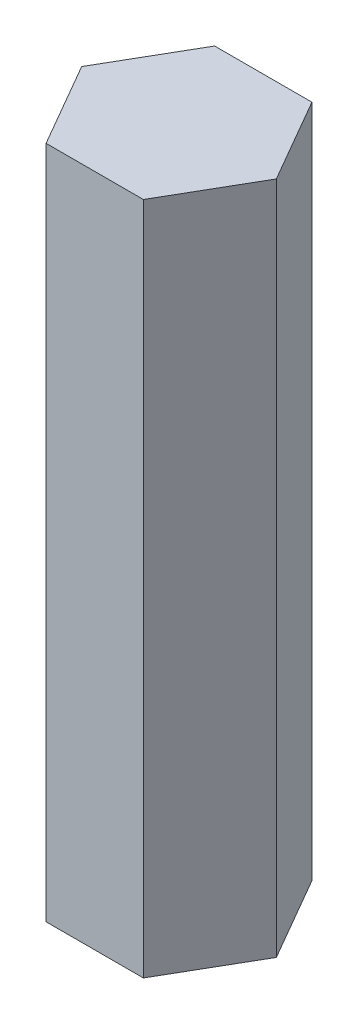
ISO-10303-21;
HEADER;
FILE_DESCRIPTION(('STEP AP214'),'2;1');
FILE_NAME('part.step','',(''),(''),'','','');
FILE_SCHEMA(('AUTOMOTIVE_DESIGN { 1 0 10303 214 1 1 1 1 }'));
ENDSEC;
DATA;
#1=APPLICATION_CONTEXT('core data for automotive mechanical design processes');
#2=APPLICATION_PROTOCOL_DEFINITION('international standard','automotive_design',2000,#1);
#3=PRODUCT_CONTEXT('',#1,'mechanical');
#4=PRODUCT('Part','Part','',(#3));
#5=PRODUCT_RELATED_PRODUCT_CATEGORY('part','',(#4));
#6=PRODUCT_DEFINITION_FORMATION('','',#4);
#7=PRODUCT_DEFINITION_CONTEXT('part definition',#1,'design');
#8=PRODUCT_DEFINITION('design','',#6,#7);
#9=PRODUCT_DEFINITION_SHAPE('','',#8);
#10=(LENGTH_UNIT() NAMED_UNIT(*) SI_UNIT(.MILLI.,.METRE.));
#11=(NAMED_UNIT(*) PLANE_ANGLE_UNIT() SI_UNIT($,.RADIAN.));
#12=(NAMED_UNIT(*) SI_UNIT($,.STERADIAN.) SOLID_ANGLE_UNIT());
#13=UNCERTAINTY_MEASURE_WITH_UNIT(LENGTH_MEASURE(1.E-05),#10,'distance_accuracy_value','');
#14=(GEOMETRIC_REPRESENTATION_CONTEXT(3) GLOBAL_UNCERTAINTY_ASSIGNED_CONTEXT((#13)) GLOBAL_UNIT_ASSIGNED_CONTEXT((#10,
#11,#12)) REPRESENTATION_CONTEXT('',''));
#15=CARTESIAN_POINT('',(0.,0.,0.));
#16=DIRECTION('',(0.,0.,1.));
#17=DIRECTION('',(1.,0.,0.));
#18=AXIS2_PLACEMENT_3D('',#15,#16,#17);
#19=CARTESIAN_POINT('',(3.6661742093542,50.8,6.34999999999996));
#20=DIRECTION('',(-0.866025403784441,0.,-0.499999999999995));
#21=DIRECTION('',(-0.499999999999995,0.,0.866025403784442));
#22=AXIS2_PLACEMENT_3D('',#19,#20,#21);
#23=PLANE('',#22);
#24=DIRECTION('',(0.499999999999995,0.,-0.866025403784441));
#25=VECTOR('',#24,1.);
#26=CARTESIAN_POINT('',(3.6661742093542,0.,6.34999999999996));
#27=LINE('',#26,#25);
#28=CARTESIAN_POINT('',(3.6661742093542,0.,6.34999999999996));
#29=VERTEX_POINT('',#28);
#30=CARTESIAN_POINT('',(7.33234841870825,0.,0.));
#31=VERTEX_POINT('',#30);
#32=EDGE_CURVE('E117',#29,#31,#27,.T.);
#33=ORIENTED_EDGE('',*,*,#32,.T.);
#34=DIRECTION('',(0.,-1.,0.));
#35=VECTOR('',#34,1.);
#36=CARTESIAN_POINT('',(7.33234841870825,50.8,0.));
#37=LINE('',#36,#35);
#38=CARTESIAN_POINT('',(7.33234841870825,50.8,0.));
#39=VERTEX_POINT('',#38);
#40=EDGE_CURVE('E11',#39,#31,#37,.T.);
#41=ORIENTED_EDGE('',*,*,#40,.F.);
#42=DIRECTION('',(0.499999999999995,0.,-0.866025403784441));
#43=VECTOR('',#42,1.);
#44=CARTESIAN_POINT('',(3.6661742093542,50.8,6.34999999999996));
#45=LINE('',#44,#43);
#46=CARTESIAN_POINT('',(3.6661742093542,50.8,6.34999999999996));
#47=VERTEX_POINT('',#46);
#48=EDGE_CURVE('E127',#47,#39,#45,.T.);
#49=ORIENTED_EDGE('',*,*,#48,.F.);
#50=DIRECTION('',(0.,-1.,0.));
#51=VECTOR('',#50,1.);
#52=CARTESIAN_POINT('',(3.6661742093542,50.8,6.34999999999996));
#53=LINE('',#52,#51);
#54=EDGE_CURVE('E113',#47,#29,#53,.T.);
#55=ORIENTED_EDGE('',*,*,#54,.T.);
#56=EDGE_LOOP('',(#33,#41,#49,#55));
#57=FACE_BOUND('',#56,.T.);
#58=ADVANCED_FACE('F33',(#57),#23,.F.);
#59=CARTESIAN_POINT('',(7.33234841870825,50.8,0.));
#60=DIRECTION('',(-0.866025403784438,0.,0.500000000000001));
#61=DIRECTION('',(0.500000000000001,0.,0.866025403784438));
#62=AXIS2_PLACEMENT_3D('',#59,#60,#61);
#63=PLANE('',#62);
#64=DIRECTION('',(-0.500000000000001,0.,-0.866025403784438));
#65=VECTOR('',#64,1.);
#66=CARTESIAN_POINT('',(7.33234841870825,0.,0.));
#67=LINE('',#66,#65);
#68=CARTESIAN_POINT('',(3.66617420935411,0.,-6.35000000000001));
#69=VERTEX_POINT('',#68);
#70=EDGE_CURVE('E120',#31,#69,#67,.T.);
#71=ORIENTED_EDGE('',*,*,#70,.T.);
#72=DIRECTION('',(0.,-1.,0.));
#73=VECTOR('',#72,1.);
#74=CARTESIAN_POINT('',(3.66617420935411,50.8,-6.35000000000001));
#75=LINE('',#74,#73);
#76=CARTESIAN_POINT('',(3.66617420935411,50.8,-6.35000000000001));
#77=VERTEX_POINT('',#76);
#78=EDGE_CURVE('E41',#77,#69,#75,.T.);
#79=ORIENTED_EDGE('',*,*,#78,.F.);
#80=DIRECTION('',(-0.500000000000001,0.,-0.866025403784438));
#81=VECTOR('',#80,1.);
#82=CARTESIAN_POINT('',(7.33234841870825,50.8,0.));
#83=LINE('',#82,#81);
#84=EDGE_CURVE('E86',#39,#77,#83,.T.);
#85=ORIENTED_EDGE('',*,*,#84,.F.);
#86=ORIENTED_EDGE('',*,*,#40,.T.);
#87=EDGE_LOOP('',(#71,#79,#85,#86));
#88=FACE_BOUND('',#87,.T.);
#89=ADVANCED_FACE('F151',(#88),#63,.F.);
#90=CARTESIAN_POINT('',(3.66617420935411,50.8,-6.35000000000001));
#91=DIRECTION('',(0.,0.,1.));
#92=DIRECTION('',(1.,0.,0.));
#93=AXIS2_PLACEMENT_3D('',#90,#91,#92);
#94=PLANE('',#93);
#95=DIRECTION('',(-1.,0.,0.));
#96=VECTOR('',#95,1.);
#97=CARTESIAN_POINT('',(3.66617420935411,0.,-6.35000000000001));
#98=LINE('',#97,#96);
#99=CARTESIAN_POINT('',(-3.66617420935416,0.,-6.34999999999999));
#100=VERTEX_POINT('',#99);
#101=EDGE_CURVE('E122',#69,#100,#98,.T.);
#102=ORIENTED_EDGE('',*,*,#101,.T.);
#103=DIRECTION('',(0.,-1.,0.));
#104=VECTOR('',#103,1.);
#105=CARTESIAN_POINT('',(-3.66617420935416,50.8,-6.34999999999999));
#106=LINE('',#105,#104);
#107=CARTESIAN_POINT('',(-3.66617420935416,50.8,-6.34999999999999));
#108=VERTEX_POINT('',#107);
#109=EDGE_CURVE('E108',#108,#100,#106,.T.);
#110=ORIENTED_EDGE('',*,*,#109,.F.);
#111=DIRECTION('',(-1.,0.,0.));
#112=VECTOR('',#111,1.);
#113=CARTESIAN_POINT('',(3.66617420935411,50.8,-6.35000000000001));
#114=LINE('',#113,#112);
#115=EDGE_CURVE('E99',#77,#108,#114,.T.);
#116=ORIENTED_EDGE('',*,*,#115,.F.);
#117=ORIENTED_EDGE('',*,*,#78,.T.);
#118=EDGE_LOOP('',(#102,#110,#116,#117));
#119=FACE_BOUND('',#118,.T.);
#120=ADVANCED_FACE('F133',(#119),#94,.F.);
#121=CARTESIAN_POINT('',(-3.66617420935416,50.8,-6.34999999999999));
#122=DIRECTION('',(0.866025403784441,0.,0.499999999999995));
#123=DIRECTION('',(0.499999999999995,0.,-0.866025403784441));
#124=AXIS2_PLACEMENT_3D('',#121,#122,#123);
#125=PLANE('',#124);
#126=DIRECTION('',(-0.499999999999995,0.,0.866025403784441));
#127=VECTOR('',#126,1.);
#128=CARTESIAN_POINT('',(-3.66617420935416,0.,-6.34999999999999));
#129=LINE('',#128,#127);
#130=CARTESIAN_POINT('',(-7.33234841870825,0.,0.));
#131=VERTEX_POINT('',#130);
#132=EDGE_CURVE('E107',#100,#131,#129,.T.);
#133=ORIENTED_EDGE('',*,*,#132,.T.);
#134=DIRECTION('',(0.,-1.,0.));
#135=VECTOR('',#134,1.);
#136=CARTESIAN_POINT('',(-7.33234841870825,50.8,0.));
#137=LINE('',#136,#135);
#138=CARTESIAN_POINT('',(-7.33234841870825,50.8,0.));
#139=VERTEX_POINT('',#138);
#140=EDGE_CURVE('E104',#139,#131,#137,.T.);
#141=ORIENTED_EDGE('',*,*,#140,.F.);
#142=DIRECTION('',(-0.499999999999995,0.,0.866025403784441));
#143=VECTOR('',#142,1.);
#144=CARTESIAN_POINT('',(-3.66617420935416,50.8,-6.34999999999999));
#145=LINE('',#144,#143);
#146=EDGE_CURVE('E93',#108,#139,#145,.T.);
#147=ORIENTED_EDGE('',*,*,#146,.F.);
#148=ORIENTED_EDGE('',*,*,#109,.T.);
#149=EDGE_LOOP('',(#133,#141,#147,#148));
#150=FACE_BOUND('',#149,.T.);
#151=ADVANCED_FACE('F105',(#150),#125,.F.);
#152=CARTESIAN_POINT('',(-7.33234841870825,50.8,0.));
#153=DIRECTION('',(0.866025403784434,0.,-0.500000000000007));
#154=DIRECTION('',(-0.500000000000007,0.,-0.866025403784434));
#155=AXIS2_PLACEMENT_3D('',#152,#153,#154);
#156=PLANE('',#155);
#157=DIRECTION('',(0.500000000000007,0.,0.866025403784434));
#158=VECTOR('',#157,1.);
#159=CARTESIAN_POINT('',(-7.33234841870825,0.,0.));
#160=LINE('',#159,#158);
#161=CARTESIAN_POINT('',(-3.66617420935407,0.,6.35000000000004));
#162=VERTEX_POINT('',#161);
#163=EDGE_CURVE('E72',#131,#162,#160,.T.);
#164=ORIENTED_EDGE('',*,*,#163,.T.);
#165=DIRECTION('',(0.,-1.,0.));
#166=VECTOR('',#165,1.);
#167=CARTESIAN_POINT('',(-3.66617420935407,50.8,6.35000000000004));
#168=LINE('',#167,#166);
#169=CARTESIAN_POINT('',(-3.66617420935407,50.8,6.35000000000004));
#170=VERTEX_POINT('',#169);
#171=EDGE_CURVE('E109',#170,#162,#168,.T.);
#172=ORIENTED_EDGE('',*,*,#171,.F.);
#173=DIRECTION('',(0.500000000000007,0.,0.866025403784434));
#174=VECTOR('',#173,1.);
#175=CARTESIAN_POINT('',(-7.33234841870825,50.8,0.));
#176=LINE('',#175,#174);
#177=EDGE_CURVE('E97',#139,#170,#176,.T.);
#178=ORIENTED_EDGE('',*,*,#177,.F.);
#179=ORIENTED_EDGE('',*,*,#140,.T.);
#180=EDGE_LOOP('',(#164,#172,#178,#179));
#181=FACE_BOUND('',#180,.T.);
#182=ADVANCED_FACE('F111',(#181),#156,.F.);
#183=CARTESIAN_POINT('',(-3.66617420935407,50.8,6.35000000000004));
#184=DIRECTION('',(0.,0.,-1.));
#185=DIRECTION('',(-1.,0.,0.));
#186=AXIS2_PLACEMENT_3D('',#183,#184,#185);
#187=PLANE('',#186);
#188=DIRECTION('',(1.,0.,0.));
#189=VECTOR('',#188,1.);
#190=CARTESIAN_POINT('',(-3.66617420935407,0.,6.35000000000004));
#191=LINE('',#190,#189);
#192=EDGE_CURVE('E78',#162,#29,#191,.T.);
#193=ORIENTED_EDGE('',*,*,#192,.T.);
#194=ORIENTED_EDGE('',*,*,#54,.F.);
#195=DIRECTION('',(1.,0.,0.));
#196=VECTOR('',#195,1.);
#197=CARTESIAN_POINT('',(-3.66617420935407,50.8,6.35000000000004));
#198=LINE('',#197,#196);
#199=EDGE_CURVE('E49',#170,#47,#198,.T.);
#200=ORIENTED_EDGE('',*,*,#199,.F.);
#201=ORIENTED_EDGE('',*,*,#171,.T.);
#202=EDGE_LOOP('',(#193,#194,#200,#201));
#203=FACE_BOUND('',#202,.T.);
#204=ADVANCED_FACE('F140',(#203),#187,.F.);
#205=CARTESIAN_POINT('',(0.,50.8,0.));
#206=DIRECTION('',(0.,1.,0.));
#207=DIRECTION('',(0.,0.,1.));
#208=AXIS2_PLACEMENT_3D('',#205,#206,#207);
#209=PLANE('',#208);
#210=ORIENTED_EDGE('',*,*,#48,.T.);
#211=ORIENTED_EDGE('',*,*,#84,.T.);
#212=ORIENTED_EDGE('',*,*,#115,.T.);
#213=ORIENTED_EDGE('',*,*,#146,.T.);
#214=ORIENTED_EDGE('',*,*,#177,.T.);
#215=ORIENTED_EDGE('',*,*,#199,.T.);
#216=EDGE_LOOP('',(#210,#211,#212,#213,#214,#215));
#217=FACE_BOUND('',#216,.T.);
#218=ADVANCED_FACE('F95',(#217),#209,.T.);
#219=CARTESIAN_POINT('',(0.,0.,0.));
#220=DIRECTION('',(0.,1.,0.));
#221=DIRECTION('',(0.,0.,1.));
#222=AXIS2_PLACEMENT_3D('',#219,#220,#221);
#223=PLANE('',#222);
#224=ORIENTED_EDGE('',*,*,#32,.F.);
#225=ORIENTED_EDGE('',*,*,#192,.F.);
#226=ORIENTED_EDGE('',*,*,#163,.F.);
#227=ORIENTED_EDGE('',*,*,#132,.F.);
#228=ORIENTED_EDGE('',*,*,#101,.F.);
#229=ORIENTED_EDGE('',*,*,#70,.F.);
#230=EDGE_LOOP('',(#224,#225,#226,#227,#228,#229));
#231=FACE_BOUND('',#230,.T.);
#232=ADVANCED_FACE('F136',(#231),#223,.F.);
#233=CLOSED_SHELL('',(#58,#89,#120,#151,#182,#204,#218,#232));
#234=MANIFOLD_SOLID_BREP('B2',#233);
#235=ADVANCED_BREP_SHAPE_REPRESENTATION('',(#18,#234),#14);
#236=SHAPE_DEFINITION_REPRESENTATION(#9,#235);
ENDSEC;
END-ISO-10303-21;
